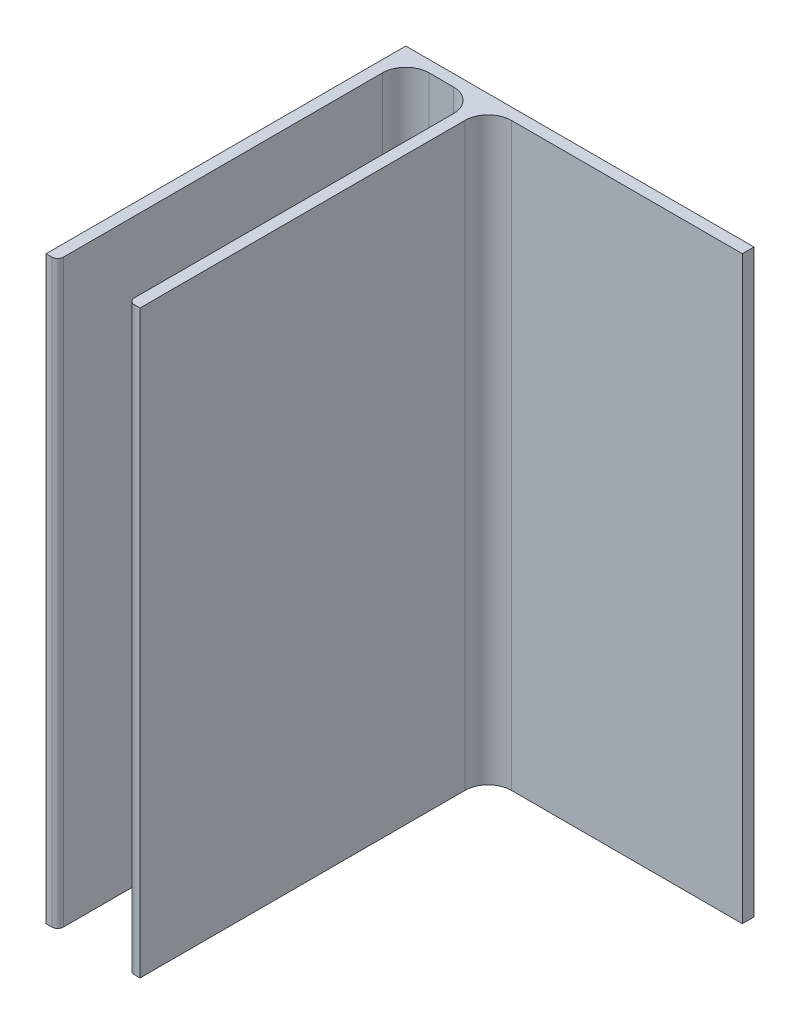
ISO-10303-21;
HEADER;
FILE_DESCRIPTION(('STEP AP214'),'2;1');
FILE_NAME('part.step','',(''),(''),'','','');
FILE_SCHEMA(('AUTOMOTIVE_DESIGN { 1 0 10303 214 1 1 1 1 }'));
ENDSEC;
DATA;
#1=APPLICATION_CONTEXT('core data for automotive mechanical design processes');
#2=APPLICATION_PROTOCOL_DEFINITION('international standard','automotive_design',2000,#1);
#3=PRODUCT_CONTEXT('',#1,'mechanical');
#4=PRODUCT('Part','Part','',(#3));
#5=PRODUCT_RELATED_PRODUCT_CATEGORY('part','',(#4));
#6=PRODUCT_DEFINITION_FORMATION('','',#4);
#7=PRODUCT_DEFINITION_CONTEXT('part definition',#1,'design');
#8=PRODUCT_DEFINITION('design','',#6,#7);
#9=PRODUCT_DEFINITION_SHAPE('','',#8);
#10=(LENGTH_UNIT() NAMED_UNIT(*) SI_UNIT(.MILLI.,.METRE.));
#11=(NAMED_UNIT(*) PLANE_ANGLE_UNIT() SI_UNIT($,.RADIAN.));
#12=(NAMED_UNIT(*) SI_UNIT($,.STERADIAN.) SOLID_ANGLE_UNIT());
#13=UNCERTAINTY_MEASURE_WITH_UNIT(LENGTH_MEASURE(1.E-05),#10,'distance_accuracy_value','');
#14=(GEOMETRIC_REPRESENTATION_CONTEXT(3) GLOBAL_UNCERTAINTY_ASSIGNED_CONTEXT((#13)) GLOBAL_UNIT_ASSIGNED_CONTEXT((#10,
#11,#12)) REPRESENTATION_CONTEXT('',''));
#15=CARTESIAN_POINT('',(0.,0.,0.));
#16=DIRECTION('',(0.,0.,1.));
#17=DIRECTION('',(1.,0.,0.));
#18=AXIS2_PLACEMENT_3D('',#15,#16,#17);
#19=CARTESIAN_POINT('',(0.,0.,1.));
#20=DIRECTION('',(0.,0.,-1.));
#21=DIRECTION('',(-1.,0.,0.));
#22=AXIS2_PLACEMENT_3D('',#19,#20,#21);
#23=PLANE('',#22);
#24=DIRECTION('',(-1.,0.,0.));
#25=VECTOR('',#24,1.);
#26=CARTESIAN_POINT('',(0.,50.,1.));
#27=LINE('',#26,#25);
#28=CARTESIAN_POINT('',(5.1,50.,1.));
#29=VERTEX_POINT('',#28);
#30=CARTESIAN_POINT('',(3.,50.,1.));
#31=VERTEX_POINT('',#30);
#32=EDGE_CURVE('E192',#29,#31,#27,.T.);
#33=ORIENTED_EDGE('',*,*,#32,.T.);
#34=DIRECTION('',(0.,1.,0.));
#35=VECTOR('',#34,1.);
#36=CARTESIAN_POINT('',(3.00000000000001,0.,1.));
#37=LINE('',#36,#35);
#38=CARTESIAN_POINT('',(3.00000000000001,0.,1.));
#39=VERTEX_POINT('',#38);
#40=EDGE_CURVE('E220',#31,#39,#37,.F.);
#41=ORIENTED_EDGE('',*,*,#40,.T.);
#42=DIRECTION('',(1.,0.,0.));
#43=VECTOR('',#42,1.);
#44=CARTESIAN_POINT('',(0.,0.,1.));
#45=LINE('',#44,#43);
#46=CARTESIAN_POINT('',(5.10000000000001,0.,1.));
#47=VERTEX_POINT('',#46);
#48=EDGE_CURVE('E188',#39,#47,#45,.T.);
#49=ORIENTED_EDGE('',*,*,#48,.T.);
#50=DIRECTION('',(0.,-1.,0.));
#51=VECTOR('',#50,1.);
#52=CARTESIAN_POINT('',(5.1,50.,1.));
#53=LINE('',#52,#51);
#54=EDGE_CURVE('E218',#47,#29,#53,.F.);
#55=ORIENTED_EDGE('',*,*,#54,.T.);
#56=EDGE_LOOP('',(#33,#41,#49,#55));
#57=FACE_BOUND('',#56,.T.);
#58=ADVANCED_FACE('F33',(#57),#23,.F.);
#59=CARTESIAN_POINT('',(30.,50.,1.));
#60=VERTEX_POINT('',#59);
#61=CARTESIAN_POINT('',(10.1,50.,1.));
#62=VERTEX_POINT('',#61);
#63=EDGE_CURVE('E193',#60,#62,#27,.T.);
#64=ORIENTED_EDGE('',*,*,#63,.T.);
#65=DIRECTION('',(0.,1.,0.));
#66=VECTOR('',#65,1.);
#67=CARTESIAN_POINT('',(10.1,0.,1.));
#68=LINE('',#67,#66);
#69=CARTESIAN_POINT('',(10.1,0.,1.));
#70=VERTEX_POINT('',#69);
#71=EDGE_CURVE('E227',#62,#70,#68,.F.);
#72=ORIENTED_EDGE('',*,*,#71,.T.);
#73=CARTESIAN_POINT('',(30.,0.,1.));
#74=VERTEX_POINT('',#73);
#75=EDGE_CURVE('E186',#70,#74,#45,.T.);
#76=ORIENTED_EDGE('',*,*,#75,.T.);
#77=DIRECTION('',(0.,1.,0.));
#78=VECTOR('',#77,1.);
#79=CARTESIAN_POINT('',(30.,0.,1.));
#80=LINE('',#79,#78);
#81=EDGE_CURVE('E190',#74,#60,#80,.T.);
#82=ORIENTED_EDGE('',*,*,#81,.T.);
#83=EDGE_LOOP('',(#64,#72,#76,#82));
#84=FACE_BOUND('',#83,.T.);
#85=ADVANCED_FACE('F299',(#84),#23,.F.);
#86=CARTESIAN_POINT('',(0.,0.,1.));
#87=DIRECTION('',(1.,0.,0.));
#88=DIRECTION('',(0.,0.,-1.));
#89=AXIS2_PLACEMENT_3D('',#86,#87,#88);
#90=PLANE('',#89);
#91=DIRECTION('',(0.,-1.,0.));
#92=VECTOR('',#91,1.);
#93=CARTESIAN_POINT('',(0.,0.,0.));
#94=LINE('',#93,#92);
#95=CARTESIAN_POINT('',(0.,50.,0.));
#96=VERTEX_POINT('',#95);
#97=CARTESIAN_POINT('',(0.,0.,0.));
#98=VERTEX_POINT('',#97);
#99=EDGE_CURVE('E185',#96,#98,#94,.T.);
#100=ORIENTED_EDGE('',*,*,#99,.T.);
#101=DIRECTION('',(0.,0.,-1.));
#102=VECTOR('',#101,1.);
#103=CARTESIAN_POINT('',(0.,0.,1.));
#104=LINE('',#103,#102);
#105=CARTESIAN_POINT('',(0.,0.,31.));
#106=VERTEX_POINT('',#105);
#107=EDGE_CURVE('E212',#106,#98,#104,.T.);
#108=ORIENTED_EDGE('',*,*,#107,.F.);
#109=DIRECTION('',(0.,-1.,0.));
#110=VECTOR('',#109,1.);
#111=CARTESIAN_POINT('',(0.,50.,31.));
#112=LINE('',#111,#110);
#113=CARTESIAN_POINT('',(0.,50.,31.));
#114=VERTEX_POINT('',#113);
#115=EDGE_CURVE('E173',#114,#106,#112,.T.);
#116=ORIENTED_EDGE('',*,*,#115,.F.);
#117=DIRECTION('',(0.,0.,-1.));
#118=VECTOR('',#117,1.);
#119=CARTESIAN_POINT('',(0.,50.,1.));
#120=LINE('',#119,#118);
#121=EDGE_CURVE('E196',#114,#96,#120,.T.);
#122=ORIENTED_EDGE('',*,*,#121,.T.);
#123=EDGE_LOOP('',(#100,#108,#116,#122));
#124=FACE_BOUND('',#123,.T.);
#125=ADVANCED_FACE('F262',(#124),#90,.F.);
#126=CARTESIAN_POINT('',(0.,0.,1.));
#127=DIRECTION('',(0.,1.,0.));
#128=DIRECTION('',(0.,0.,1.));
#129=AXIS2_PLACEMENT_3D('',#126,#127,#128);
#130=PLANE('',#129);
#131=DIRECTION('',(1.,0.,0.));
#132=VECTOR('',#131,1.);
#133=CARTESIAN_POINT('',(7.10000000000001,0.,31.));
#134=LINE('',#133,#132);
#135=CARTESIAN_POINT('',(7.60000000000001,0.,31.));
#136=VERTEX_POINT('',#135);
#137=CARTESIAN_POINT('',(8.10000000000001,0.,31.));
#138=VERTEX_POINT('',#137);
#139=EDGE_CURVE('E139',#136,#138,#134,.T.);
#140=ORIENTED_EDGE('',*,*,#139,.F.);
#141=CARTESIAN_POINT('',(7.60000000000001,0.,30.5));
#142=DIRECTION('',(0.,1.,0.));
#143=DIRECTION('',(0.,0.,1.));
#144=AXIS2_PLACEMENT_3D('',#141,#142,#143);
#145=CIRCLE('',#144,0.5);
#146=CARTESIAN_POINT('',(7.10000000000001,0.,30.5));
#147=VERTEX_POINT('',#146);
#148=EDGE_CURVE('E245',#136,#147,#145,.F.);
#149=ORIENTED_EDGE('',*,*,#148,.T.);
#150=DIRECTION('',(0.,0.,-1.));
#151=VECTOR('',#150,1.);
#152=CARTESIAN_POINT('',(7.10000000000001,0.,31.));
#153=LINE('',#152,#151);
#154=CARTESIAN_POINT('',(7.10000000000001,0.,3.));
#155=VERTEX_POINT('',#154);
#156=EDGE_CURVE('E159',#147,#155,#153,.T.);
#157=ORIENTED_EDGE('',*,*,#156,.T.);
#158=CARTESIAN_POINT('',(5.10000000000001,0.,3.));
#159=DIRECTION('',(0.,1.,0.));
#160=DIRECTION('',(0.,0.,1.));
#161=AXIS2_PLACEMENT_3D('',#158,#159,#160);
#162=CIRCLE('',#161,2.);
#163=EDGE_CURVE('E234',#155,#47,#162,.T.);
#164=ORIENTED_EDGE('',*,*,#163,.T.);
#165=ORIENTED_EDGE('',*,*,#48,.F.);
#166=CARTESIAN_POINT('',(3.00000000000001,0.,3.));
#167=DIRECTION('',(0.,1.,0.));
#168=DIRECTION('',(0.,0.,1.));
#169=AXIS2_PLACEMENT_3D('',#166,#167,#168);
#170=CIRCLE('',#169,2.);
#171=CARTESIAN_POINT('',(1.00000000000001,0.,3.));
#172=VERTEX_POINT('',#171);
#173=EDGE_CURVE('E231',#39,#172,#170,.T.);
#174=ORIENTED_EDGE('',*,*,#173,.T.);
#175=DIRECTION('',(0.,0.,-1.));
#176=VECTOR('',#175,1.);
#177=CARTESIAN_POINT('',(1.00000000000001,0.,31.));
#178=LINE('',#177,#176);
#179=CARTESIAN_POINT('',(1.00000000000001,0.,30.5));
#180=VERTEX_POINT('',#179);
#181=EDGE_CURVE('E183',#180,#172,#178,.T.);
#182=ORIENTED_EDGE('',*,*,#181,.F.);
#183=CARTESIAN_POINT('',(0.500000000000006,0.,30.5));
#184=DIRECTION('',(0.,1.,0.));
#185=DIRECTION('',(0.,0.,1.));
#186=AXIS2_PLACEMENT_3D('',#183,#184,#185);
#187=CIRCLE('',#186,0.5);
#188=CARTESIAN_POINT('',(0.500000000000006,0.,31.));
#189=VERTEX_POINT('',#188);
#190=EDGE_CURVE('E243',#180,#189,#187,.F.);
#191=ORIENTED_EDGE('',*,*,#190,.T.);
#192=DIRECTION('',(1.,0.,0.));
#193=VECTOR('',#192,1.);
#194=CARTESIAN_POINT('',(0.,0.,31.));
#195=LINE('',#194,#193);
#196=EDGE_CURVE('E176',#106,#189,#195,.T.);
#197=ORIENTED_EDGE('',*,*,#196,.F.);
#198=ORIENTED_EDGE('',*,*,#107,.T.);
#199=DIRECTION('',(1.,0.,0.));
#200=VECTOR('',#199,1.);
#201=CARTESIAN_POINT('',(0.,0.,0.));
#202=LINE('',#201,#200);
#203=CARTESIAN_POINT('',(30.,0.,0.));
#204=VERTEX_POINT('',#203);
#205=EDGE_CURVE('E199',#98,#204,#202,.T.);
#206=ORIENTED_EDGE('',*,*,#205,.T.);
#207=DIRECTION('',(0.,0.,-1.));
#208=VECTOR('',#207,1.);
#209=CARTESIAN_POINT('',(30.,0.,1.));
#210=LINE('',#209,#208);
#211=EDGE_CURVE('E209',#74,#204,#210,.T.);
#212=ORIENTED_EDGE('',*,*,#211,.F.);
#213=ORIENTED_EDGE('',*,*,#75,.F.);
#214=CARTESIAN_POINT('',(10.1,0.,3.));
#215=DIRECTION('',(0.,1.,0.));
#216=DIRECTION('',(0.,0.,1.));
#217=AXIS2_PLACEMENT_3D('',#214,#215,#216);
#218=CIRCLE('',#217,2.);
#219=CARTESIAN_POINT('',(8.10000000000001,0.,3.));
#220=VERTEX_POINT('',#219);
#221=EDGE_CURVE('E155',#70,#220,#218,.T.);
#222=ORIENTED_EDGE('',*,*,#221,.T.);
#223=DIRECTION('',(0.,0.,-1.));
#224=VECTOR('',#223,1.);
#225=CARTESIAN_POINT('',(8.10000000000001,0.,31.));
#226=LINE('',#225,#224);
#227=EDGE_CURVE('E151',#138,#220,#226,.T.);
#228=ORIENTED_EDGE('',*,*,#227,.F.);
#229=EDGE_LOOP('',(#140,#149,#157,#164,#165,#174,#182,#191,#197,#198,#206,#212,#213,#222,#228));
#230=FACE_BOUND('',#229,.T.);
#231=ADVANCED_FACE('F152',(#230),#130,.F.);
#232=CARTESIAN_POINT('',(30.,0.,1.));
#233=DIRECTION('',(-1.,0.,0.));
#234=DIRECTION('',(0.,0.,1.));
#235=AXIS2_PLACEMENT_3D('',#232,#233,#234);
#236=PLANE('',#235);
#237=DIRECTION('',(0.,1.,0.));
#238=VECTOR('',#237,1.);
#239=CARTESIAN_POINT('',(30.,0.,0.));
#240=LINE('',#239,#238);
#241=CARTESIAN_POINT('',(30.,50.,0.));
#242=VERTEX_POINT('',#241);
#243=EDGE_CURVE('E201',#204,#242,#240,.T.);
#244=ORIENTED_EDGE('',*,*,#243,.T.);
#245=DIRECTION('',(0.,0.,-1.));
#246=VECTOR('',#245,1.);
#247=CARTESIAN_POINT('',(30.,50.,1.));
#248=LINE('',#247,#246);
#249=EDGE_CURVE('E206',#60,#242,#248,.T.);
#250=ORIENTED_EDGE('',*,*,#249,.F.);
#251=ORIENTED_EDGE('',*,*,#81,.F.);
#252=ORIENTED_EDGE('',*,*,#211,.T.);
#253=EDGE_LOOP('',(#244,#250,#251,#252));
#254=FACE_BOUND('',#253,.T.);
#255=ADVANCED_FACE('F314',(#254),#236,.F.);
#256=CARTESIAN_POINT('',(0.,50.,1.));
#257=DIRECTION('',(0.,-1.,0.));
#258=DIRECTION('',(0.,0.,-1.));
#259=AXIS2_PLACEMENT_3D('',#256,#257,#258);
#260=PLANE('',#259);
#261=DIRECTION('',(0.,0.,-1.));
#262=VECTOR('',#261,1.);
#263=CARTESIAN_POINT('',(7.1,50.,31.));
#264=LINE('',#263,#262);
#265=CARTESIAN_POINT('',(7.1,50.,30.5));
#266=VERTEX_POINT('',#265);
#267=CARTESIAN_POINT('',(7.1,50.,3.));
#268=VERTEX_POINT('',#267);
#269=EDGE_CURVE('E167',#266,#268,#264,.T.);
#270=ORIENTED_EDGE('',*,*,#269,.F.);
#271=CARTESIAN_POINT('',(7.6,50.,30.5));
#272=DIRECTION('',(0.,-1.,0.));
#273=DIRECTION('',(0.,0.,-1.));
#274=AXIS2_PLACEMENT_3D('',#271,#272,#273);
#275=CIRCLE('',#274,0.5);
#276=CARTESIAN_POINT('',(7.6,50.,31.));
#277=VERTEX_POINT('',#276);
#278=EDGE_CURVE('E250',#266,#277,#275,.F.);
#279=ORIENTED_EDGE('',*,*,#278,.T.);
#280=DIRECTION('',(-1.,0.,0.));
#281=VECTOR('',#280,1.);
#282=CARTESIAN_POINT('',(7.1,50.,31.));
#283=LINE('',#282,#281);
#284=CARTESIAN_POINT('',(8.1,50.,31.));
#285=VERTEX_POINT('',#284);
#286=EDGE_CURVE('E165',#285,#277,#283,.T.);
#287=ORIENTED_EDGE('',*,*,#286,.F.);
#288=DIRECTION('',(0.,0.,-1.));
#289=VECTOR('',#288,1.);
#290=CARTESIAN_POINT('',(8.1,50.,31.));
#291=LINE('',#290,#289);
#292=CARTESIAN_POINT('',(8.1,50.,3.));
#293=VERTEX_POINT('',#292);
#294=EDGE_CURVE('E160',#285,#293,#291,.T.);
#295=ORIENTED_EDGE('',*,*,#294,.T.);
#296=CARTESIAN_POINT('',(10.1,50.,3.));
#297=DIRECTION('',(0.,-1.,0.));
#298=DIRECTION('',(0.,0.,-1.));
#299=AXIS2_PLACEMENT_3D('',#296,#297,#298);
#300=CIRCLE('',#299,2.);
#301=EDGE_CURVE('E239',#293,#62,#300,.T.);
#302=ORIENTED_EDGE('',*,*,#301,.T.);
#303=ORIENTED_EDGE('',*,*,#63,.F.);
#304=ORIENTED_EDGE('',*,*,#249,.T.);
#305=DIRECTION('',(-1.,0.,0.));
#306=VECTOR('',#305,1.);
#307=CARTESIAN_POINT('',(0.,50.,0.));
#308=LINE('',#307,#306);
#309=EDGE_CURVE('E189',#242,#96,#308,.T.);
#310=ORIENTED_EDGE('',*,*,#309,.T.);
#311=ORIENTED_EDGE('',*,*,#121,.F.);
#312=DIRECTION('',(-1.,0.,0.));
#313=VECTOR('',#312,1.);
#314=CARTESIAN_POINT('',(0.,50.,31.));
#315=LINE('',#314,#313);
#316=CARTESIAN_POINT('',(0.5,50.,31.));
#317=VERTEX_POINT('',#316);
#318=EDGE_CURVE('E179',#317,#114,#315,.T.);
#319=ORIENTED_EDGE('',*,*,#318,.F.);
#320=CARTESIAN_POINT('',(0.5,50.,30.5));
#321=DIRECTION('',(0.,-1.,0.));
#322=DIRECTION('',(0.,0.,-1.));
#323=AXIS2_PLACEMENT_3D('',#320,#321,#322);
#324=CIRCLE('',#323,0.5);
#325=CARTESIAN_POINT('',(1.,50.,30.5));
#326=VERTEX_POINT('',#325);
#327=EDGE_CURVE('E48',#317,#326,#324,.F.);
#328=ORIENTED_EDGE('',*,*,#327,.T.);
#329=DIRECTION('',(0.,0.,-1.));
#330=VECTOR('',#329,1.);
#331=CARTESIAN_POINT('',(1.,50.,31.));
#332=LINE('',#331,#330);
#333=CARTESIAN_POINT('',(1.,50.,3.));
#334=VERTEX_POINT('',#333);
#335=EDGE_CURVE('E181',#326,#334,#332,.T.);
#336=ORIENTED_EDGE('',*,*,#335,.T.);
#337=CARTESIAN_POINT('',(3.,50.,3.));
#338=DIRECTION('',(0.,-1.,0.));
#339=DIRECTION('',(0.,0.,-1.));
#340=AXIS2_PLACEMENT_3D('',#337,#338,#339);
#341=CIRCLE('',#340,2.);
#342=EDGE_CURVE('E229',#334,#31,#341,.T.);
#343=ORIENTED_EDGE('',*,*,#342,.T.);
#344=ORIENTED_EDGE('',*,*,#32,.F.);
#345=CARTESIAN_POINT('',(5.1,50.,3.));
#346=DIRECTION('',(0.,-1.,0.));
#347=DIRECTION('',(0.,0.,-1.));
#348=AXIS2_PLACEMENT_3D('',#345,#346,#347);
#349=CIRCLE('',#348,2.);
#350=EDGE_CURVE('E236',#29,#268,#349,.T.);
#351=ORIENTED_EDGE('',*,*,#350,.T.);
#352=EDGE_LOOP('',(#270,#279,#287,#295,#302,#303,#304,#310,#311,#319,#328,#336,#343,#344,#351));
#353=FACE_BOUND('',#352,.T.);
#354=ADVANCED_FACE('F257',(#353),#260,.F.);
#355=CARTESIAN_POINT('',(0.,0.,0.));
#356=DIRECTION('',(0.,0.,-1.));
#357=DIRECTION('',(-1.,0.,0.));
#358=AXIS2_PLACEMENT_3D('',#355,#356,#357);
#359=PLANE('',#358);
#360=ORIENTED_EDGE('',*,*,#99,.F.);
#361=ORIENTED_EDGE('',*,*,#309,.F.);
#362=ORIENTED_EDGE('',*,*,#243,.F.);
#363=ORIENTED_EDGE('',*,*,#205,.F.);
#364=EDGE_LOOP('',(#360,#361,#362,#363));
#365=FACE_BOUND('',#364,.T.);
#366=ADVANCED_FACE('F308',(#365),#359,.T.);
#367=CARTESIAN_POINT('',(1.,50.,31.));
#368=DIRECTION('',(-1.,0.,0.));
#369=DIRECTION('',(0.,-1.,0.));
#370=AXIS2_PLACEMENT_3D('',#367,#368,#369);
#371=PLANE('',#370);
#372=ORIENTED_EDGE('',*,*,#335,.F.);
#373=DIRECTION('',(0.,1.,0.));
#374=VECTOR('',#373,1.);
#375=CARTESIAN_POINT('',(1.00000000000001,0.,30.5));
#376=LINE('',#375,#374);
#377=EDGE_CURVE('E11',#326,#180,#376,.F.);
#378=ORIENTED_EDGE('',*,*,#377,.T.);
#379=ORIENTED_EDGE('',*,*,#181,.T.);
#380=DIRECTION('',(0.,1.,0.));
#381=VECTOR('',#380,1.);
#382=CARTESIAN_POINT('',(1.,50.,3.));
#383=LINE('',#382,#381);
#384=EDGE_CURVE('E215',#172,#334,#383,.T.);
#385=ORIENTED_EDGE('',*,*,#384,.T.);
#386=EDGE_LOOP('',(#372,#378,#379,#385));
#387=FACE_BOUND('',#386,.T.);
#388=ADVANCED_FACE('F265',(#387),#371,.F.);
#389=CARTESIAN_POINT('',(0.,0.,31.));
#390=DIRECTION('',(0.,0.,1.));
#391=DIRECTION('',(1.,0.,0.));
#392=AXIS2_PLACEMENT_3D('',#389,#390,#391);
#393=PLANE('',#392);
#394=ORIENTED_EDGE('',*,*,#196,.T.);
#395=DIRECTION('',(0.,1.,0.));
#396=VECTOR('',#395,1.);
#397=CARTESIAN_POINT('',(0.5,50.,31.));
#398=LINE('',#397,#396);
#399=EDGE_CURVE('E41',#189,#317,#398,.T.);
#400=ORIENTED_EDGE('',*,*,#399,.T.);
#401=ORIENTED_EDGE('',*,*,#318,.T.);
#402=ORIENTED_EDGE('',*,*,#115,.T.);
#403=EDGE_LOOP('',(#394,#400,#401,#402));
#404=FACE_BOUND('',#403,.T.);
#405=ADVANCED_FACE('F252',(#404),#393,.T.);
#406=CARTESIAN_POINT('',(7.1,50.,31.));
#407=DIRECTION('',(1.,0.,0.));
#408=DIRECTION('',(0.,1.,0.));
#409=AXIS2_PLACEMENT_3D('',#406,#407,#408);
#410=PLANE('',#409);
#411=ORIENTED_EDGE('',*,*,#156,.F.);
#412=DIRECTION('',(0.,-1.,0.));
#413=VECTOR('',#412,1.);
#414=CARTESIAN_POINT('',(7.1,50.,30.5));
#415=LINE('',#414,#413);
#416=EDGE_CURVE('E247',#147,#266,#415,.F.);
#417=ORIENTED_EDGE('',*,*,#416,.T.);
#418=ORIENTED_EDGE('',*,*,#269,.T.);
#419=DIRECTION('',(0.,-1.,0.));
#420=VECTOR('',#419,1.);
#421=CARTESIAN_POINT('',(7.10000000000001,0.,3.));
#422=LINE('',#421,#420);
#423=EDGE_CURVE('E222',#268,#155,#422,.T.);
#424=ORIENTED_EDGE('',*,*,#423,.T.);
#425=EDGE_LOOP('',(#411,#417,#418,#424));
#426=FACE_BOUND('',#425,.T.);
#427=ADVANCED_FACE('F285',(#426),#410,.F.);
#428=CARTESIAN_POINT('',(8.1,50.,31.));
#429=DIRECTION('',(-1.,0.,0.));
#430=DIRECTION('',(0.,-1.,0.));
#431=AXIS2_PLACEMENT_3D('',#428,#429,#430);
#432=PLANE('',#431);
#433=ORIENTED_EDGE('',*,*,#227,.T.);
#434=DIRECTION('',(0.,1.,0.));
#435=VECTOR('',#434,1.);
#436=CARTESIAN_POINT('',(8.1,50.,3.));
#437=LINE('',#436,#435);
#438=EDGE_CURVE('E225',#220,#293,#437,.T.);
#439=ORIENTED_EDGE('',*,*,#438,.T.);
#440=ORIENTED_EDGE('',*,*,#294,.F.);
#441=DIRECTION('',(0.,1.,0.));
#442=VECTOR('',#441,1.);
#443=CARTESIAN_POINT('',(8.1,50.,31.));
#444=LINE('',#443,#442);
#445=EDGE_CURVE('E144',#138,#285,#444,.T.);
#446=ORIENTED_EDGE('',*,*,#445,.F.);
#447=EDGE_LOOP('',(#433,#439,#440,#446));
#448=FACE_BOUND('',#447,.T.);
#449=ADVANCED_FACE('F162',(#448),#432,.F.);
#450=CARTESIAN_POINT('',(0.,0.,31.));
#451=DIRECTION('',(0.,0.,1.));
#452=DIRECTION('',(1.,0.,0.));
#453=AXIS2_PLACEMENT_3D('',#450,#451,#452);
#454=PLANE('',#453);
#455=ORIENTED_EDGE('',*,*,#286,.T.);
#456=DIRECTION('',(0.,-1.,0.));
#457=VECTOR('',#456,1.);
#458=CARTESIAN_POINT('',(7.60000000000001,0.,31.));
#459=LINE('',#458,#457);
#460=EDGE_CURVE('E147',#277,#136,#459,.T.);
#461=ORIENTED_EDGE('',*,*,#460,.T.);
#462=ORIENTED_EDGE('',*,*,#139,.T.);
#463=ORIENTED_EDGE('',*,*,#445,.T.);
#464=EDGE_LOOP('',(#455,#461,#462,#463));
#465=FACE_BOUND('',#464,.T.);
#466=ADVANCED_FACE('F142',(#465),#454,.T.);
#467=CARTESIAN_POINT('',(3.,50.,3.));
#468=DIRECTION('',(0.,-1.,0.));
#469=DIRECTION('',(1.,0.,0.));
#470=AXIS2_PLACEMENT_3D('',#467,#468,#469);
#471=CYLINDRICAL_SURFACE('',#470,2.);
#472=ORIENTED_EDGE('',*,*,#173,.F.);
#473=ORIENTED_EDGE('',*,*,#40,.F.);
#474=ORIENTED_EDGE('',*,*,#342,.F.);
#475=ORIENTED_EDGE('',*,*,#384,.F.);
#476=EDGE_LOOP('',(#472,#473,#474,#475));
#477=FACE_BOUND('',#476,.T.);
#478=ADVANCED_FACE('F273',(#477),#471,.F.);
#479=CARTESIAN_POINT('',(5.1,50.,3.));
#480=DIRECTION('',(0.,1.,0.));
#481=DIRECTION('',(-1.,0.,0.));
#482=AXIS2_PLACEMENT_3D('',#479,#480,#481);
#483=CYLINDRICAL_SURFACE('',#482,2.);
#484=ORIENTED_EDGE('',*,*,#350,.F.);
#485=ORIENTED_EDGE('',*,*,#54,.F.);
#486=ORIENTED_EDGE('',*,*,#163,.F.);
#487=ORIENTED_EDGE('',*,*,#423,.F.);
#488=EDGE_LOOP('',(#484,#485,#486,#487));
#489=FACE_BOUND('',#488,.T.);
#490=ADVANCED_FACE('F283',(#489),#483,.F.);
#491=CARTESIAN_POINT('',(10.1,50.,3.));
#492=DIRECTION('',(0.,-1.,0.));
#493=DIRECTION('',(1.,0.,0.));
#494=AXIS2_PLACEMENT_3D('',#491,#492,#493);
#495=CYLINDRICAL_SURFACE('',#494,2.);
#496=ORIENTED_EDGE('',*,*,#221,.F.);
#497=ORIENTED_EDGE('',*,*,#71,.F.);
#498=ORIENTED_EDGE('',*,*,#301,.F.);
#499=ORIENTED_EDGE('',*,*,#438,.F.);
#500=EDGE_LOOP('',(#496,#497,#498,#499));
#501=FACE_BOUND('',#500,.T.);
#502=ADVANCED_FACE('F291',(#501),#495,.F.);
#503=CARTESIAN_POINT('',(7.60000000000001,0.,30.5));
#504=DIRECTION('',(0.,1.,0.));
#505=DIRECTION('',(-1.,0.,0.));
#506=AXIS2_PLACEMENT_3D('',#503,#504,#505);
#507=CYLINDRICAL_SURFACE('',#506,0.5);
#508=ORIENTED_EDGE('',*,*,#278,.F.);
#509=ORIENTED_EDGE('',*,*,#416,.F.);
#510=ORIENTED_EDGE('',*,*,#148,.F.);
#511=ORIENTED_EDGE('',*,*,#460,.F.);
#512=EDGE_LOOP('',(#508,#509,#510,#511));
#513=FACE_BOUND('',#512,.T.);
#514=ADVANCED_FACE('F289',(#513),#507,.T.);
#515=CARTESIAN_POINT('',(0.500000000000006,0.,30.5));
#516=DIRECTION('',(0.,-1.,0.));
#517=DIRECTION('',(1.,0.,0.));
#518=AXIS2_PLACEMENT_3D('',#515,#516,#517);
#519=CYLINDRICAL_SURFACE('',#518,0.5);
#520=ORIENTED_EDGE('',*,*,#190,.F.);
#521=ORIENTED_EDGE('',*,*,#377,.F.);
#522=ORIENTED_EDGE('',*,*,#327,.F.);
#523=ORIENTED_EDGE('',*,*,#399,.F.);
#524=EDGE_LOOP('',(#520,#521,#522,#523));
#525=FACE_BOUND('',#524,.T.);
#526=ADVANCED_FACE('F35',(#525),#519,.T.);
#527=CLOSED_SHELL('',(#58,#85,#125,#231,#255,#354,#366,#388,#405,#427,#449,#466,#478,#490,#502,
#514,#526));
#528=MANIFOLD_SOLID_BREP('B2',#527);
#529=ADVANCED_BREP_SHAPE_REPRESENTATION('',(#18,#528),#14);
#530=SHAPE_DEFINITION_REPRESENTATION(#9,#529);
ENDSEC;
END-ISO-10303-21;
